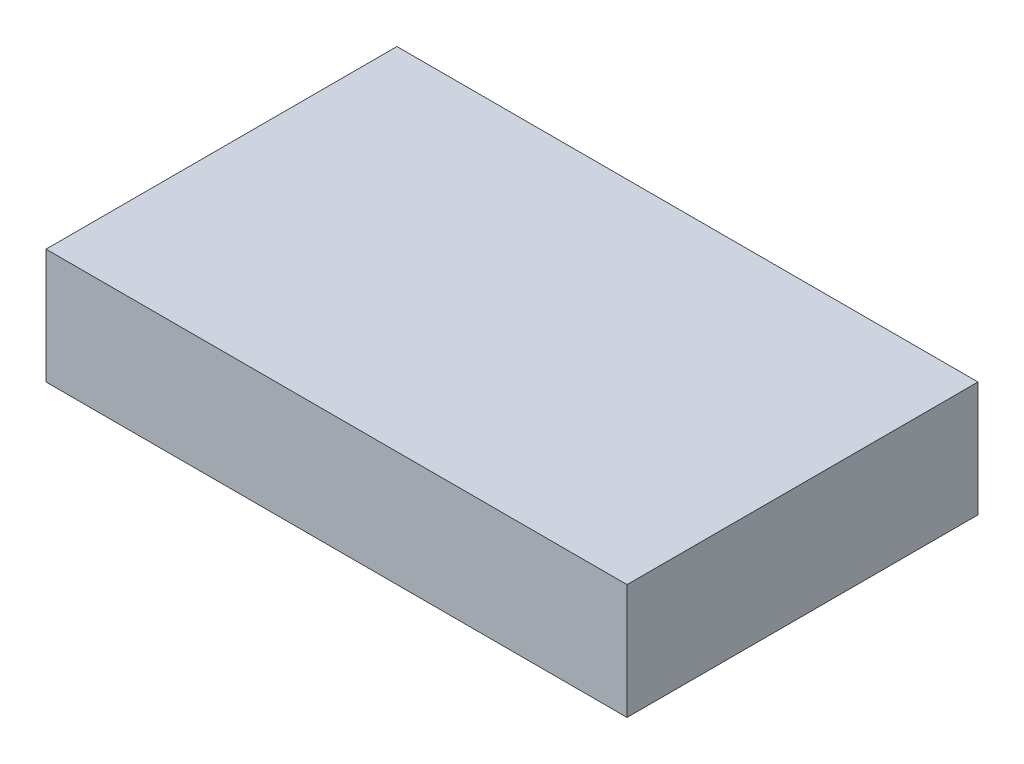
ISO-10303-21;
HEADER;
FILE_DESCRIPTION(('STEP AP214'),'2;1');
FILE_NAME('part.step','',(''),(''),'','','');
FILE_SCHEMA(('AUTOMOTIVE_DESIGN { 1 0 10303 214 1 1 1 1 }'));
ENDSEC;
DATA;
#1=APPLICATION_CONTEXT('core data for automotive mechanical design processes');
#2=APPLICATION_PROTOCOL_DEFINITION('international standard','automotive_design',2000,#1);
#3=PRODUCT_CONTEXT('',#1,'mechanical');
#4=PRODUCT('Part','Part','',(#3));
#5=PRODUCT_RELATED_PRODUCT_CATEGORY('part','',(#4));
#6=PRODUCT_DEFINITION_FORMATION('','',#4);
#7=PRODUCT_DEFINITION_CONTEXT('part definition',#1,'design');
#8=PRODUCT_DEFINITION('design','',#6,#7);
#9=PRODUCT_DEFINITION_SHAPE('','',#8);
#10=(LENGTH_UNIT() NAMED_UNIT(*) SI_UNIT(.MILLI.,.METRE.));
#11=(NAMED_UNIT(*) PLANE_ANGLE_UNIT() SI_UNIT($,.RADIAN.));
#12=(NAMED_UNIT(*) SI_UNIT($,.STERADIAN.) SOLID_ANGLE_UNIT());
#13=UNCERTAINTY_MEASURE_WITH_UNIT(LENGTH_MEASURE(1.E-05),#10,'distance_accuracy_value','');
#14=(GEOMETRIC_REPRESENTATION_CONTEXT(3) GLOBAL_UNCERTAINTY_ASSIGNED_CONTEXT((#13)) GLOBAL_UNIT_ASSIGNED_CONTEXT((#10,
#11,#12)) REPRESENTATION_CONTEXT('',''));
#15=CARTESIAN_POINT('',(0.,0.,0.));
#16=DIRECTION('',(0.,0.,1.));
#17=DIRECTION('',(1.,0.,0.));
#18=AXIS2_PLACEMENT_3D('',#15,#16,#17);
#19=CARTESIAN_POINT('',(5.05,2.,-3.05));
#20=DIRECTION('',(-1.,0.,0.));
#21=DIRECTION('',(0.,0.,1.));
#22=AXIS2_PLACEMENT_3D('',#19,#20,#21);
#23=PLANE('',#22);
#24=DIRECTION('',(0.,0.,-1.));
#25=VECTOR('',#24,1.);
#26=CARTESIAN_POINT('',(5.05,0.,-3.05));
#27=LINE('',#26,#25);
#28=CARTESIAN_POINT('',(5.05,0.,3.05));
#29=VERTEX_POINT('',#28);
#30=CARTESIAN_POINT('',(5.05,0.,-3.05));
#31=VERTEX_POINT('',#30);
#32=EDGE_CURVE('E96',#29,#31,#27,.T.);
#33=ORIENTED_EDGE('',*,*,#32,.T.);
#34=DIRECTION('',(0.,-1.,0.));
#35=VECTOR('',#34,1.);
#36=CARTESIAN_POINT('',(5.05,2.,-3.05));
#37=LINE('',#36,#35);
#38=CARTESIAN_POINT('',(5.05,2.,-3.05));
#39=VERTEX_POINT('',#38);
#40=EDGE_CURVE('E11',#39,#31,#37,.T.);
#41=ORIENTED_EDGE('',*,*,#40,.F.);
#42=DIRECTION('',(0.,0.,-1.));
#43=VECTOR('',#42,1.);
#44=CARTESIAN_POINT('',(5.05,2.,-3.05));
#45=LINE('',#44,#43);
#46=CARTESIAN_POINT('',(5.05,2.,3.05));
#47=VERTEX_POINT('',#46);
#48=EDGE_CURVE('E84',#47,#39,#45,.T.);
#49=ORIENTED_EDGE('',*,*,#48,.F.);
#50=DIRECTION('',(0.,-1.,0.));
#51=VECTOR('',#50,1.);
#52=CARTESIAN_POINT('',(5.05,2.,3.05));
#53=LINE('',#52,#51);
#54=EDGE_CURVE('E92',#47,#29,#53,.T.);
#55=ORIENTED_EDGE('',*,*,#54,.T.);
#56=EDGE_LOOP('',(#33,#41,#49,#55));
#57=FACE_BOUND('',#56,.T.);
#58=ADVANCED_FACE('F33',(#57),#23,.F.);
#59=CARTESIAN_POINT('',(-5.05,2.,-3.05));
#60=DIRECTION('',(0.,0.,1.));
#61=DIRECTION('',(1.,0.,0.));
#62=AXIS2_PLACEMENT_3D('',#59,#60,#61);
#63=PLANE('',#62);
#64=DIRECTION('',(-1.,0.,0.));
#65=VECTOR('',#64,1.);
#66=CARTESIAN_POINT('',(-5.05,0.,-3.05));
#67=LINE('',#66,#65);
#68=CARTESIAN_POINT('',(-5.05,0.,-3.05));
#69=VERTEX_POINT('',#68);
#70=EDGE_CURVE('E88',#31,#69,#67,.T.);
#71=ORIENTED_EDGE('',*,*,#70,.T.);
#72=DIRECTION('',(0.,-1.,0.));
#73=VECTOR('',#72,1.);
#74=CARTESIAN_POINT('',(-5.05,2.,-3.05));
#75=LINE('',#74,#73);
#76=CARTESIAN_POINT('',(-5.05,2.,-3.05));
#77=VERTEX_POINT('',#76);
#78=EDGE_CURVE('E41',#77,#69,#75,.T.);
#79=ORIENTED_EDGE('',*,*,#78,.F.);
#80=DIRECTION('',(-1.,0.,0.));
#81=VECTOR('',#80,1.);
#82=CARTESIAN_POINT('',(-5.05,2.,-3.05));
#83=LINE('',#82,#81);
#84=EDGE_CURVE('E79',#39,#77,#83,.T.);
#85=ORIENTED_EDGE('',*,*,#84,.F.);
#86=ORIENTED_EDGE('',*,*,#40,.T.);
#87=EDGE_LOOP('',(#71,#79,#85,#86));
#88=FACE_BOUND('',#87,.T.);
#89=ADVANCED_FACE('F87',(#88),#63,.F.);
#90=CARTESIAN_POINT('',(-5.05,2.,-3.05));
#91=DIRECTION('',(1.,0.,0.));
#92=DIRECTION('',(0.,0.,-1.));
#93=AXIS2_PLACEMENT_3D('',#90,#91,#92);
#94=PLANE('',#93);
#95=DIRECTION('',(0.,0.,1.));
#96=VECTOR('',#95,1.);
#97=CARTESIAN_POINT('',(-5.05,0.,-3.05));
#98=LINE('',#97,#96);
#99=CARTESIAN_POINT('',(-5.05,0.,3.05));
#100=VERTEX_POINT('',#99);
#101=EDGE_CURVE('E66',#69,#100,#98,.T.);
#102=ORIENTED_EDGE('',*,*,#101,.T.);
#103=DIRECTION('',(0.,-1.,0.));
#104=VECTOR('',#103,1.);
#105=CARTESIAN_POINT('',(-5.05,2.,3.05));
#106=LINE('',#105,#104);
#107=CARTESIAN_POINT('',(-5.05,2.,3.05));
#108=VERTEX_POINT('',#107);
#109=EDGE_CURVE('E89',#108,#100,#106,.T.);
#110=ORIENTED_EDGE('',*,*,#109,.F.);
#111=DIRECTION('',(0.,0.,1.));
#112=VECTOR('',#111,1.);
#113=CARTESIAN_POINT('',(-5.05,2.,-3.05));
#114=LINE('',#113,#112);
#115=EDGE_CURVE('E82',#77,#108,#114,.T.);
#116=ORIENTED_EDGE('',*,*,#115,.F.);
#117=ORIENTED_EDGE('',*,*,#78,.T.);
#118=EDGE_LOOP('',(#102,#110,#116,#117));
#119=FACE_BOUND('',#118,.T.);
#120=ADVANCED_FACE('F90',(#119),#94,.F.);
#121=CARTESIAN_POINT('',(-5.05,2.,3.05));
#122=DIRECTION('',(0.,0.,-1.));
#123=DIRECTION('',(-1.,0.,0.));
#124=AXIS2_PLACEMENT_3D('',#121,#122,#123);
#125=PLANE('',#124);
#126=DIRECTION('',(1.,0.,0.));
#127=VECTOR('',#126,1.);
#128=CARTESIAN_POINT('',(-5.05,0.,3.05));
#129=LINE('',#128,#127);
#130=EDGE_CURVE('E72',#100,#29,#129,.T.);
#131=ORIENTED_EDGE('',*,*,#130,.T.);
#132=ORIENTED_EDGE('',*,*,#54,.F.);
#133=DIRECTION('',(1.,0.,0.));
#134=VECTOR('',#133,1.);
#135=CARTESIAN_POINT('',(-5.05,2.,3.05));
#136=LINE('',#135,#134);
#137=EDGE_CURVE('E49',#108,#47,#136,.T.);
#138=ORIENTED_EDGE('',*,*,#137,.F.);
#139=ORIENTED_EDGE('',*,*,#109,.T.);
#140=EDGE_LOOP('',(#131,#132,#138,#139));
#141=FACE_BOUND('',#140,.T.);
#142=ADVANCED_FACE('F103',(#141),#125,.F.);
#143=CARTESIAN_POINT('',(0.,2.,0.));
#144=DIRECTION('',(0.,1.,0.));
#145=DIRECTION('',(0.,0.,1.));
#146=AXIS2_PLACEMENT_3D('',#143,#144,#145);
#147=PLANE('',#146);
#148=ORIENTED_EDGE('',*,*,#48,.T.);
#149=ORIENTED_EDGE('',*,*,#84,.T.);
#150=ORIENTED_EDGE('',*,*,#115,.T.);
#151=ORIENTED_EDGE('',*,*,#137,.T.);
#152=EDGE_LOOP('',(#148,#149,#150,#151));
#153=FACE_BOUND('',#152,.T.);
#154=ADVANCED_FACE('F80',(#153),#147,.T.);
#155=CARTESIAN_POINT('',(0.,0.,0.));
#156=DIRECTION('',(0.,1.,0.));
#157=DIRECTION('',(0.,0.,1.));
#158=AXIS2_PLACEMENT_3D('',#155,#156,#157);
#159=PLANE('',#158);
#160=ORIENTED_EDGE('',*,*,#32,.F.);
#161=ORIENTED_EDGE('',*,*,#130,.F.);
#162=ORIENTED_EDGE('',*,*,#101,.F.);
#163=ORIENTED_EDGE('',*,*,#70,.F.);
#164=EDGE_LOOP('',(#160,#161,#162,#163));
#165=FACE_BOUND('',#164,.T.);
#166=ADVANCED_FACE('F106',(#165),#159,.F.);
#167=CLOSED_SHELL('',(#58,#89,#120,#142,#154,#166));
#168=MANIFOLD_SOLID_BREP('B2',#167);
#169=ADVANCED_BREP_SHAPE_REPRESENTATION('',(#18,#168),#14);
#170=SHAPE_DEFINITION_REPRESENTATION(#9,#169);
ENDSEC;
END-ISO-10303-21;
